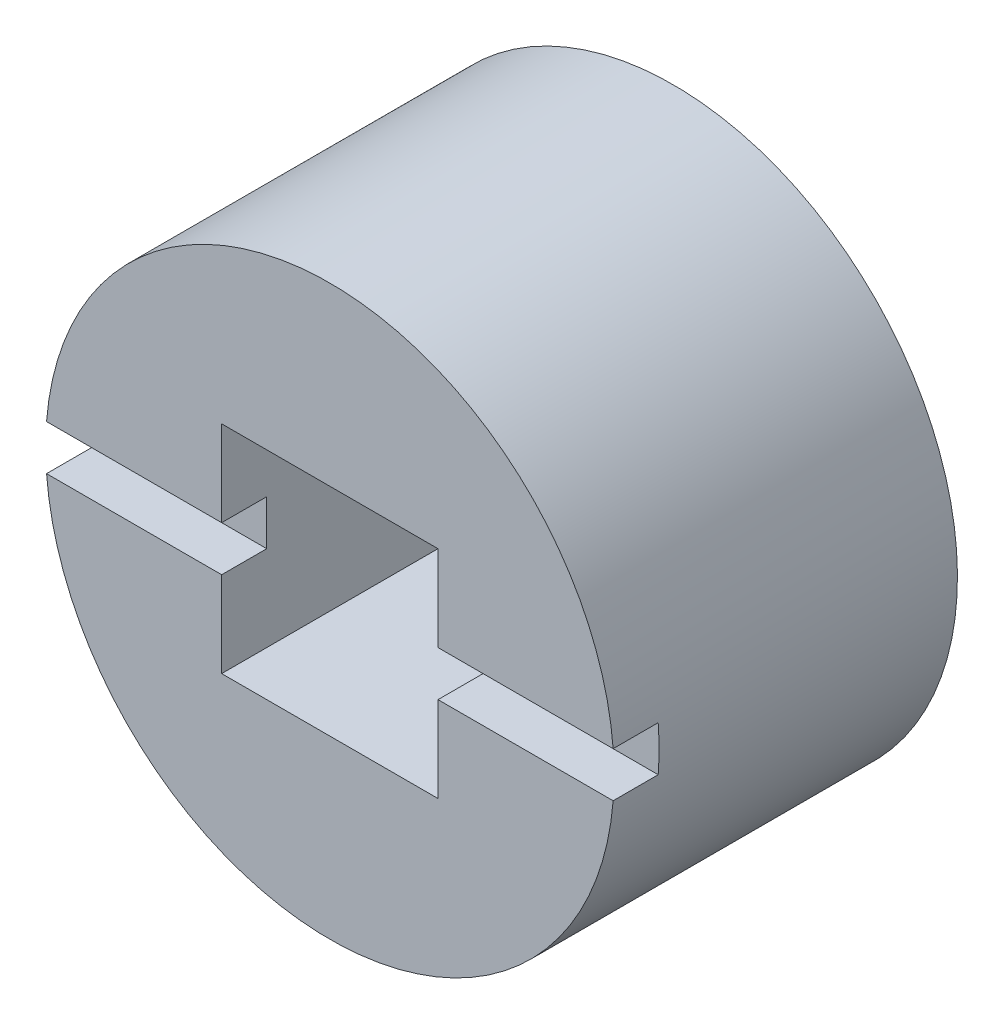
ISO-10303-21;
HEADER;
FILE_DESCRIPTION(('STEP AP214'),'2;1');
FILE_NAME('part.step','',(''),(''),'','','');
FILE_SCHEMA(('AUTOMOTIVE_DESIGN { 1 0 10303 214 1 1 1 1 }'));
ENDSEC;
DATA;
#1=APPLICATION_CONTEXT('core data for automotive mechanical design processes');
#2=APPLICATION_PROTOCOL_DEFINITION('international standard','automotive_design',2000,#1);
#3=PRODUCT_CONTEXT('',#1,'mechanical');
#4=PRODUCT('Part','Part','',(#3));
#5=PRODUCT_RELATED_PRODUCT_CATEGORY('part','',(#4));
#6=PRODUCT_DEFINITION_FORMATION('','',#4);
#7=PRODUCT_DEFINITION_CONTEXT('part definition',#1,'design');
#8=PRODUCT_DEFINITION('design','',#6,#7);
#9=PRODUCT_DEFINITION_SHAPE('','',#8);
#10=(LENGTH_UNIT() NAMED_UNIT(*) SI_UNIT(.MILLI.,.METRE.));
#11=(NAMED_UNIT(*) PLANE_ANGLE_UNIT() SI_UNIT($,.RADIAN.));
#12=(NAMED_UNIT(*) SI_UNIT($,.STERADIAN.) SOLID_ANGLE_UNIT());
#13=UNCERTAINTY_MEASURE_WITH_UNIT(LENGTH_MEASURE(1.E-05),#10,'distance_accuracy_value','');
#14=(GEOMETRIC_REPRESENTATION_CONTEXT(3) GLOBAL_UNCERTAINTY_ASSIGNED_CONTEXT((#13)) GLOBAL_UNIT_ASSIGNED_CONTEXT((#10,
#11,#12)) REPRESENTATION_CONTEXT('',''));
#15=CARTESIAN_POINT('',(0.,0.,0.));
#16=DIRECTION('',(0.,0.,1.));
#17=DIRECTION('',(1.,0.,0.));
#18=AXIS2_PLACEMENT_3D('',#15,#16,#17);
#19=CARTESIAN_POINT('',(25.3199840894369,103.404109270209,-15.875));
#20=DIRECTION('',(0.,0.,1.));
#21=DIRECTION('',(1.,0.,0.));
#22=AXIS2_PLACEMENT_3D('',#19,#20,#21);
#23=PLANE('',#22);
#24=DIRECTION('',(1.,0.,0.));
#25=VECTOR('',#24,1.);
#26=CARTESIAN_POINT('',(17.4307911014481,103.154109270209,-15.875));
#27=LINE('',#26,#25);
#28=CARTESIAN_POINT('',(22.177301072451,103.154109270209,-15.875));
#29=VERTEX_POINT('',#28);
#30=CARTESIAN_POINT('',(24.1199840894369,103.154109270209,-15.875));
#31=VERTEX_POINT('',#30);
#32=EDGE_CURVE('E177',#29,#31,#27,.T.);
#33=ORIENTED_EDGE('',*,*,#32,.F.);
#34=CARTESIAN_POINT('',(25.3199840894369,103.404109270209,-15.875));
#35=DIRECTION('',(0.,0.,1.));
#36=DIRECTION('',(1.,0.,0.));
#37=AXIS2_PLACEMENT_3D('',#34,#35,#36);
#38=CIRCLE('',#37,3.15261106786919);
#39=CARTESIAN_POINT('',(28.4626671064227,103.154109270209,-15.875));
#40=VERTEX_POINT('',#39);
#41=EDGE_CURVE('E149',#29,#40,#38,.T.);
#42=ORIENTED_EDGE('',*,*,#41,.T.);
#43=CARTESIAN_POINT('',(26.5199840894368,103.154109270209,-15.875));
#44=VERTEX_POINT('',#43);
#45=EDGE_CURVE('E140',#44,#40,#27,.T.);
#46=ORIENTED_EDGE('',*,*,#45,.F.);
#47=DIRECTION('',(0.,1.,0.));
#48=VECTOR('',#47,1.);
#49=CARTESIAN_POINT('',(26.5199840894368,104.604109270209,-15.875));
#50=LINE('',#49,#48);
#51=CARTESIAN_POINT('',(26.5199840894368,102.204109270209,-15.875));
#52=VERTEX_POINT('',#51);
#53=EDGE_CURVE('E205',#52,#44,#50,.T.);
#54=ORIENTED_EDGE('',*,*,#53,.F.);
#55=DIRECTION('',(1.,0.,0.));
#56=VECTOR('',#55,1.);
#57=CARTESIAN_POINT('',(24.1199840894369,102.204109270209,-15.875));
#58=LINE('',#57,#56);
#59=CARTESIAN_POINT('',(24.1199840894369,102.204109270209,-15.875));
#60=VERTEX_POINT('',#59);
#61=EDGE_CURVE('E196',#60,#52,#58,.T.);
#62=ORIENTED_EDGE('',*,*,#61,.F.);
#63=DIRECTION('',(0.,-1.,0.));
#64=VECTOR('',#63,1.);
#65=CARTESIAN_POINT('',(24.1199840894369,104.604109270209,-15.875));
#66=LINE('',#65,#64);
#67=EDGE_CURVE('E211',#31,#60,#66,.T.);
#68=ORIENTED_EDGE('',*,*,#67,.F.);
#69=EDGE_LOOP('',(#33,#42,#46,#54,#62,#68));
#70=FACE_BOUND('',#69,.T.);
#71=ADVANCED_FACE('F33',(#70),#23,.T.);
#72=CARTESIAN_POINT('',(208.28,20.6375,-19.685));
#73=DIRECTION('',(0.,0.,-1.));
#74=DIRECTION('',(-1.,0.,0.));
#75=AXIS2_PLACEMENT_3D('',#72,#73,#74);
#76=PLANE('',#75);
#77=CARTESIAN_POINT('',(25.3199840894369,103.404109270209,-19.685));
#78=DIRECTION('',(0.,0.,-1.));
#79=DIRECTION('',(-1.,0.,0.));
#80=AXIS2_PLACEMENT_3D('',#77,#78,#79);
#81=CIRCLE('',#80,3.15261106786919);
#82=CARTESIAN_POINT('',(22.1673730215677,103.404109270209,-19.685));
#83=VERTEX_POINT('',#82);
#84=EDGE_CURVE('E148',#83,#83,#81,.F.);
#85=ORIENTED_EDGE('',*,*,#84,.F.);
#86=EDGE_LOOP('',(#85));
#87=FACE_BOUND('',#86,.T.);
#88=ADVANCED_FACE('F35',(#87),#76,.T.);
#89=DIRECTION('',(-1.,0.,0.));
#90=VECTOR('',#89,1.);
#91=CARTESIAN_POINT('',(17.4307911014481,103.654109270209,-15.875));
#92=LINE('',#91,#90);
#93=CARTESIAN_POINT('',(28.4626671064227,103.654109270209,-15.875));
#94=VERTEX_POINT('',#93);
#95=CARTESIAN_POINT('',(26.5199840894368,103.654109270209,-15.875));
#96=VERTEX_POINT('',#95);
#97=EDGE_CURVE('E124',#94,#96,#92,.T.);
#98=ORIENTED_EDGE('',*,*,#97,.F.);
#99=CARTESIAN_POINT('',(22.177301072451,103.654109270209,-15.875));
#100=VERTEX_POINT('',#99);
#101=EDGE_CURVE('E137',#94,#100,#38,.T.);
#102=ORIENTED_EDGE('',*,*,#101,.T.);
#103=CARTESIAN_POINT('',(24.1199840894369,103.654109270209,-15.875));
#104=VERTEX_POINT('',#103);
#105=EDGE_CURVE('E141',#104,#100,#92,.T.);
#106=ORIENTED_EDGE('',*,*,#105,.F.);
#107=CARTESIAN_POINT('',(24.1199840894369,104.604109270209,-15.875));
#108=VERTEX_POINT('',#107);
#109=EDGE_CURVE('E166',#108,#104,#66,.T.);
#110=ORIENTED_EDGE('',*,*,#109,.F.);
#111=DIRECTION('',(-1.,0.,0.));
#112=VECTOR('',#111,1.);
#113=CARTESIAN_POINT('',(24.1199840894369,104.604109270209,-15.875));
#114=LINE('',#113,#112);
#115=CARTESIAN_POINT('',(26.5199840894368,104.604109270209,-15.875));
#116=VERTEX_POINT('',#115);
#117=EDGE_CURVE('E208',#116,#108,#114,.T.);
#118=ORIENTED_EDGE('',*,*,#117,.F.);
#119=EDGE_CURVE('E139',#96,#116,#50,.T.);
#120=ORIENTED_EDGE('',*,*,#119,.F.);
#121=EDGE_LOOP('',(#98,#102,#106,#110,#118,#120));
#122=FACE_BOUND('',#121,.T.);
#123=ADVANCED_FACE('F135',(#122),#23,.T.);
#124=CARTESIAN_POINT('',(25.3199840894369,103.404109270209,-38.736540918157));
#125=DIRECTION('',(0.,0.,1.));
#126=DIRECTION('',(1.,0.,0.));
#127=AXIS2_PLACEMENT_3D('',#124,#125,#126);
#128=CYLINDRICAL_SURFACE('',#127,3.15261106786919);
#129=DIRECTION('',(0.,0.,1.));
#130=VECTOR('',#129,1.);
#131=CARTESIAN_POINT('',(22.177301072451,103.154109270209,-38.736540918157));
#132=LINE('',#131,#130);
#133=CARTESIAN_POINT('',(22.177301072451,103.154109270209,-16.375));
#134=VERTEX_POINT('',#133);
#135=EDGE_CURVE('E188',#134,#29,#132,.T.);
#136=ORIENTED_EDGE('',*,*,#135,.F.);
#137=CARTESIAN_POINT('',(25.3199840894369,103.404109270209,-16.375));
#138=DIRECTION('',(0.,0.,1.));
#139=DIRECTION('',(1.,0.,0.));
#140=AXIS2_PLACEMENT_3D('',#137,#138,#139);
#141=CIRCLE('',#140,3.15261106786919);
#142=CARTESIAN_POINT('',(22.177301072451,103.654109270209,-16.375));
#143=VERTEX_POINT('',#142);
#144=EDGE_CURVE('E182',#134,#143,#141,.F.);
#145=ORIENTED_EDGE('',*,*,#144,.T.);
#146=DIRECTION('',(0.,0.,1.));
#147=VECTOR('',#146,1.);
#148=CARTESIAN_POINT('',(22.177301072451,103.654109270209,-38.736540918157));
#149=LINE('',#148,#147);
#150=EDGE_CURVE('E129',#100,#143,#149,.F.);
#151=ORIENTED_EDGE('',*,*,#150,.F.);
#152=ORIENTED_EDGE('',*,*,#101,.F.);
#153=DIRECTION('',(0.,0.,1.));
#154=VECTOR('',#153,1.);
#155=CARTESIAN_POINT('',(28.4626671064227,103.654109270209,-38.736540918157));
#156=LINE('',#155,#154);
#157=CARTESIAN_POINT('',(28.4626671064227,103.654109270209,-16.375));
#158=VERTEX_POINT('',#157);
#159=EDGE_CURVE('E121',#158,#94,#156,.T.);
#160=ORIENTED_EDGE('',*,*,#159,.F.);
#161=CARTESIAN_POINT('',(28.4626671064227,103.154109270209,-16.375));
#162=VERTEX_POINT('',#161);
#163=EDGE_CURVE('E180',#158,#162,#141,.F.);
#164=ORIENTED_EDGE('',*,*,#163,.T.);
#165=DIRECTION('',(0.,0.,1.));
#166=VECTOR('',#165,1.);
#167=CARTESIAN_POINT('',(28.4626671064227,103.154109270209,-38.736540918157));
#168=LINE('',#167,#166);
#169=EDGE_CURVE('E190',#40,#162,#168,.F.);
#170=ORIENTED_EDGE('',*,*,#169,.F.);
#171=ORIENTED_EDGE('',*,*,#41,.F.);
#172=EDGE_LOOP('',(#136,#145,#151,#152,#160,#164,#170,#171));
#173=FACE_BOUND('',#172,.T.);
#174=ORIENTED_EDGE('',*,*,#84,.T.);
#175=EDGE_LOOP('',(#174));
#176=FACE_BOUND('',#175,.T.);
#177=ADVANCED_FACE('F145',(#173,#176),#128,.T.);
#178=CARTESIAN_POINT('',(26.5199840894368,104.604109270209,-18.796));
#179=DIRECTION('',(1.,0.,0.));
#180=DIRECTION('',(0.,0.,-1.));
#181=AXIS2_PLACEMENT_3D('',#178,#179,#180);
#182=PLANE('',#181);
#183=ORIENTED_EDGE('',*,*,#53,.T.);
#184=DIRECTION('',(0.,0.,-1.));
#185=VECTOR('',#184,1.);
#186=CARTESIAN_POINT('',(26.5199840894368,103.154109270209,-18.796));
#187=LINE('',#186,#185);
#188=CARTESIAN_POINT('',(26.5199840894368,103.154109270209,-16.375));
#189=VERTEX_POINT('',#188);
#190=EDGE_CURVE('E185',#44,#189,#187,.T.);
#191=ORIENTED_EDGE('',*,*,#190,.T.);
#192=DIRECTION('',(0.,-1.,0.));
#193=VECTOR('',#192,1.);
#194=CARTESIAN_POINT('',(26.5199840894368,104.604109270209,-16.375));
#195=LINE('',#194,#193);
#196=CARTESIAN_POINT('',(26.5199840894368,103.654109270209,-16.375));
#197=VERTEX_POINT('',#196);
#198=EDGE_CURVE('E178',#197,#189,#195,.T.);
#199=ORIENTED_EDGE('',*,*,#198,.F.);
#200=DIRECTION('',(0.,0.,1.));
#201=VECTOR('',#200,1.);
#202=CARTESIAN_POINT('',(26.5199840894368,103.654109270209,-18.796));
#203=LINE('',#202,#201);
#204=EDGE_CURVE('E130',#197,#96,#203,.T.);
#205=ORIENTED_EDGE('',*,*,#204,.T.);
#206=ORIENTED_EDGE('',*,*,#119,.T.);
#207=DIRECTION('',(0.,0.,1.));
#208=VECTOR('',#207,1.);
#209=CARTESIAN_POINT('',(26.5199840894368,104.604109270209,-18.796));
#210=LINE('',#209,#208);
#211=CARTESIAN_POINT('',(26.5199840894368,104.604109270209,-18.796));
#212=VERTEX_POINT('',#211);
#213=EDGE_CURVE('E157',#212,#116,#210,.T.);
#214=ORIENTED_EDGE('',*,*,#213,.F.);
#215=DIRECTION('',(0.,1.,0.));
#216=VECTOR('',#215,1.);
#217=CARTESIAN_POINT('',(26.5199840894368,104.604109270209,-18.796));
#218=LINE('',#217,#216);
#219=CARTESIAN_POINT('',(26.5199840894368,102.204109270209,-18.796));
#220=VERTEX_POINT('',#219);
#221=EDGE_CURVE('E192',#220,#212,#218,.T.);
#222=ORIENTED_EDGE('',*,*,#221,.F.);
#223=DIRECTION('',(0.,0.,1.));
#224=VECTOR('',#223,1.);
#225=CARTESIAN_POINT('',(26.5199840894368,102.204109270209,-18.796));
#226=LINE('',#225,#224);
#227=EDGE_CURVE('E155',#220,#52,#226,.T.);
#228=ORIENTED_EDGE('',*,*,#227,.T.);
#229=EDGE_LOOP('',(#183,#191,#199,#205,#206,#214,#222,#228));
#230=FACE_BOUND('',#229,.T.);
#231=ADVANCED_FACE('F226',(#230),#182,.F.);
#232=CARTESIAN_POINT('',(24.1199840894369,102.204109270209,-18.796));
#233=DIRECTION('',(0.,-1.,0.));
#234=DIRECTION('',(0.,0.,-1.));
#235=AXIS2_PLACEMENT_3D('',#232,#233,#234);
#236=PLANE('',#235);
#237=ORIENTED_EDGE('',*,*,#61,.T.);
#238=ORIENTED_EDGE('',*,*,#227,.F.);
#239=DIRECTION('',(1.,0.,0.));
#240=VECTOR('',#239,1.);
#241=CARTESIAN_POINT('',(24.1199840894369,102.204109270209,-18.796));
#242=LINE('',#241,#240);
#243=CARTESIAN_POINT('',(24.1199840894369,102.204109270209,-18.796));
#244=VERTEX_POINT('',#243);
#245=EDGE_CURVE('E202',#244,#220,#242,.T.);
#246=ORIENTED_EDGE('',*,*,#245,.F.);
#247=DIRECTION('',(0.,0.,1.));
#248=VECTOR('',#247,1.);
#249=CARTESIAN_POINT('',(24.1199840894369,102.204109270209,-18.796));
#250=LINE('',#249,#248);
#251=EDGE_CURVE('E216',#244,#60,#250,.T.);
#252=ORIENTED_EDGE('',*,*,#251,.T.);
#253=EDGE_LOOP('',(#237,#238,#246,#252));
#254=FACE_BOUND('',#253,.T.);
#255=ADVANCED_FACE('F244',(#254),#236,.F.);
#256=CARTESIAN_POINT('',(24.1199840894369,104.604109270209,-18.796));
#257=DIRECTION('',(-1.,0.,0.));
#258=DIRECTION('',(0.,0.,1.));
#259=AXIS2_PLACEMENT_3D('',#256,#257,#258);
#260=PLANE('',#259);
#261=DIRECTION('',(0.,1.,0.));
#262=VECTOR('',#261,1.);
#263=CARTESIAN_POINT('',(24.1199840894369,104.604109270209,-16.375));
#264=LINE('',#263,#262);
#265=CARTESIAN_POINT('',(24.1199840894369,103.154109270209,-16.375));
#266=VERTEX_POINT('',#265);
#267=CARTESIAN_POINT('',(24.1199840894369,103.654109270209,-16.375));
#268=VERTEX_POINT('',#267);
#269=EDGE_CURVE('E152',#266,#268,#264,.T.);
#270=ORIENTED_EDGE('',*,*,#269,.F.);
#271=DIRECTION('',(0.,0.,1.));
#272=VECTOR('',#271,1.);
#273=CARTESIAN_POINT('',(24.1199840894369,103.154109270209,-18.796));
#274=LINE('',#273,#272);
#275=EDGE_CURVE('E11',#266,#31,#274,.T.);
#276=ORIENTED_EDGE('',*,*,#275,.T.);
#277=ORIENTED_EDGE('',*,*,#67,.T.);
#278=ORIENTED_EDGE('',*,*,#251,.F.);
#279=DIRECTION('',(0.,-1.,0.));
#280=VECTOR('',#279,1.);
#281=CARTESIAN_POINT('',(24.1199840894369,104.604109270209,-18.796));
#282=LINE('',#281,#280);
#283=CARTESIAN_POINT('',(24.1199840894369,104.604109270209,-18.796));
#284=VERTEX_POINT('',#283);
#285=EDGE_CURVE('E199',#284,#244,#282,.T.);
#286=ORIENTED_EDGE('',*,*,#285,.F.);
#287=DIRECTION('',(0.,0.,1.));
#288=VECTOR('',#287,1.);
#289=CARTESIAN_POINT('',(24.1199840894369,104.604109270209,-18.796));
#290=LINE('',#289,#288);
#291=EDGE_CURVE('E218',#284,#108,#290,.T.);
#292=ORIENTED_EDGE('',*,*,#291,.T.);
#293=ORIENTED_EDGE('',*,*,#109,.T.);
#294=DIRECTION('',(0.,0.,-1.));
#295=VECTOR('',#294,1.);
#296=CARTESIAN_POINT('',(24.1199840894369,103.654109270209,-18.796));
#297=LINE('',#296,#295);
#298=EDGE_CURVE('E41',#104,#268,#297,.T.);
#299=ORIENTED_EDGE('',*,*,#298,.T.);
#300=EDGE_LOOP('',(#270,#276,#277,#278,#286,#292,#293,#299));
#301=FACE_BOUND('',#300,.T.);
#302=ADVANCED_FACE('F164',(#301),#260,.F.);
#303=CARTESIAN_POINT('',(24.1199840894369,104.604109270209,-18.796));
#304=DIRECTION('',(0.,1.,0.));
#305=DIRECTION('',(0.,0.,1.));
#306=AXIS2_PLACEMENT_3D('',#303,#304,#305);
#307=PLANE('',#306);
#308=ORIENTED_EDGE('',*,*,#117,.T.);
#309=ORIENTED_EDGE('',*,*,#291,.F.);
#310=DIRECTION('',(-1.,0.,0.));
#311=VECTOR('',#310,1.);
#312=CARTESIAN_POINT('',(24.1199840894369,104.604109270209,-18.796));
#313=LINE('',#312,#311);
#314=EDGE_CURVE('E195',#212,#284,#313,.T.);
#315=ORIENTED_EDGE('',*,*,#314,.F.);
#316=ORIENTED_EDGE('',*,*,#213,.T.);
#317=EDGE_LOOP('',(#308,#309,#315,#316));
#318=FACE_BOUND('',#317,.T.);
#319=ADVANCED_FACE('F223',(#318),#307,.F.);
#320=CARTESIAN_POINT('',(0.,0.,-18.796));
#321=DIRECTION('',(0.,0.,1.));
#322=DIRECTION('',(1.,0.,0.));
#323=AXIS2_PLACEMENT_3D('',#320,#321,#322);
#324=PLANE('',#323);
#325=ORIENTED_EDGE('',*,*,#221,.T.);
#326=ORIENTED_EDGE('',*,*,#314,.T.);
#327=ORIENTED_EDGE('',*,*,#285,.T.);
#328=ORIENTED_EDGE('',*,*,#245,.T.);
#329=EDGE_LOOP('',(#325,#326,#327,#328));
#330=FACE_BOUND('',#329,.T.);
#331=ADVANCED_FACE('F247',(#330),#324,.T.);
#332=CARTESIAN_POINT('',(0.,0.,-16.375));
#333=DIRECTION('',(0.,0.,1.));
#334=DIRECTION('',(1.,0.,0.));
#335=AXIS2_PLACEMENT_3D('',#332,#333,#334);
#336=PLANE('',#335);
#337=DIRECTION('',(1.,0.,0.));
#338=VECTOR('',#337,1.);
#339=CARTESIAN_POINT('',(17.4307911014481,103.154109270209,-16.375));
#340=LINE('',#339,#338);
#341=EDGE_CURVE('E56',#134,#266,#340,.T.);
#342=ORIENTED_EDGE('',*,*,#341,.T.);
#343=ORIENTED_EDGE('',*,*,#269,.T.);
#344=DIRECTION('',(-1.,0.,0.));
#345=VECTOR('',#344,1.);
#346=CARTESIAN_POINT('',(17.4307911014481,103.654109270209,-16.375));
#347=LINE('',#346,#345);
#348=EDGE_CURVE('E171',#268,#143,#347,.T.);
#349=ORIENTED_EDGE('',*,*,#348,.T.);
#350=ORIENTED_EDGE('',*,*,#144,.F.);
#351=EDGE_LOOP('',(#342,#343,#349,#350));
#352=FACE_BOUND('',#351,.T.);
#353=ADVANCED_FACE('F249',(#352),#336,.T.);
#354=CARTESIAN_POINT('',(17.4307911014481,103.654109270209,-16.375));
#355=DIRECTION('',(0.,1.,0.));
#356=DIRECTION('',(0.,0.,1.));
#357=AXIS2_PLACEMENT_3D('',#354,#355,#356);
#358=PLANE('',#357);
#359=ORIENTED_EDGE('',*,*,#150,.T.);
#360=ORIENTED_EDGE('',*,*,#348,.F.);
#361=ORIENTED_EDGE('',*,*,#298,.F.);
#362=ORIENTED_EDGE('',*,*,#105,.T.);
#363=EDGE_LOOP('',(#359,#360,#361,#362));
#364=FACE_BOUND('',#363,.T.);
#365=ADVANCED_FACE('F169',(#364),#358,.F.);
#366=CARTESIAN_POINT('',(17.4307911014481,103.154109270209,-16.375));
#367=DIRECTION('',(0.,-1.,0.));
#368=DIRECTION('',(0.,0.,-1.));
#369=AXIS2_PLACEMENT_3D('',#366,#367,#368);
#370=PLANE('',#369);
#371=ORIENTED_EDGE('',*,*,#135,.T.);
#372=ORIENTED_EDGE('',*,*,#32,.T.);
#373=ORIENTED_EDGE('',*,*,#275,.F.);
#374=ORIENTED_EDGE('',*,*,#341,.F.);
#375=EDGE_LOOP('',(#371,#372,#373,#374));
#376=FACE_BOUND('',#375,.T.);
#377=ADVANCED_FACE('F237',(#376),#370,.F.);
#378=ORIENTED_EDGE('',*,*,#169,.T.);
#379=EDGE_CURVE('E174',#189,#162,#340,.T.);
#380=ORIENTED_EDGE('',*,*,#379,.F.);
#381=ORIENTED_EDGE('',*,*,#190,.F.);
#382=ORIENTED_EDGE('',*,*,#45,.T.);
#383=EDGE_LOOP('',(#378,#380,#381,#382));
#384=FACE_BOUND('',#383,.T.);
#385=ADVANCED_FACE('F232',(#384),#370,.F.);
#386=ORIENTED_EDGE('',*,*,#159,.T.);
#387=ORIENTED_EDGE('',*,*,#97,.T.);
#388=ORIENTED_EDGE('',*,*,#204,.F.);
#389=EDGE_CURVE('E48',#158,#197,#347,.T.);
#390=ORIENTED_EDGE('',*,*,#389,.F.);
#391=EDGE_LOOP('',(#386,#387,#388,#390));
#392=FACE_BOUND('',#391,.T.);
#393=ADVANCED_FACE('F123',(#392),#358,.F.);
#394=ORIENTED_EDGE('',*,*,#389,.T.);
#395=ORIENTED_EDGE('',*,*,#198,.T.);
#396=ORIENTED_EDGE('',*,*,#379,.T.);
#397=ORIENTED_EDGE('',*,*,#163,.F.);
#398=EDGE_LOOP('',(#394,#395,#396,#397));
#399=FACE_BOUND('',#398,.T.);
#400=ADVANCED_FACE('F230',(#399),#336,.T.);
#401=CLOSED_SHELL('',(#71,#88,#123,#177,#231,#255,#302,#319,#331,#353,#365,#377,#385,#393,#400));
#402=MANIFOLD_SOLID_BREP('B2',#401);
#403=ADVANCED_BREP_SHAPE_REPRESENTATION('',(#18,#402),#14);
#404=SHAPE_DEFINITION_REPRESENTATION(#9,#403);
ENDSEC;
END-ISO-10303-21;
